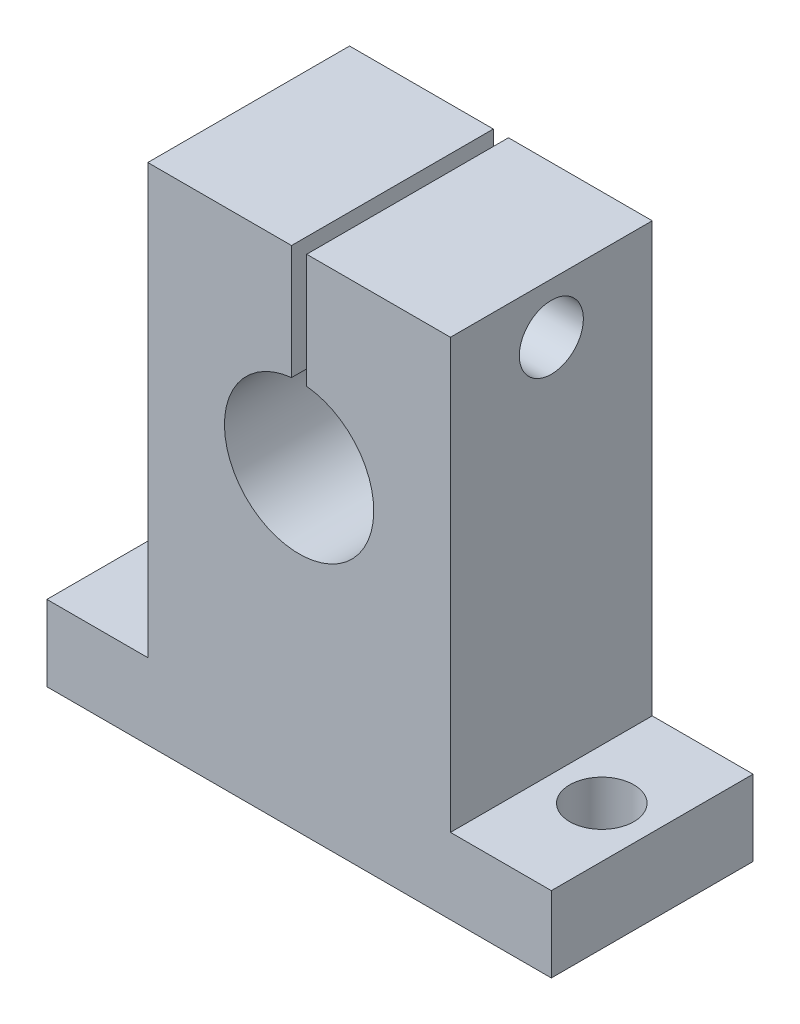
ISO-10303-21;
HEADER;
FILE_DESCRIPTION(('STEP AP214'),'2;1');
FILE_NAME('part.step','',(''),(''),'','','');
FILE_SCHEMA(('AUTOMOTIVE_DESIGN { 1 0 10303 214 1 1 1 1 }'));
ENDSEC;
DATA;
#1=APPLICATION_CONTEXT('core data for automotive mechanical design processes');
#2=APPLICATION_PROTOCOL_DEFINITION('international standard','automotive_design',2000,#1);
#3=PRODUCT_CONTEXT('',#1,'mechanical');
#4=PRODUCT('Part','Part','',(#3));
#5=PRODUCT_RELATED_PRODUCT_CATEGORY('part','',(#4));
#6=PRODUCT_DEFINITION_FORMATION('','',#4);
#7=PRODUCT_DEFINITION_CONTEXT('part definition',#1,'design');
#8=PRODUCT_DEFINITION('design','',#6,#7);
#9=PRODUCT_DEFINITION_SHAPE('','',#8);
#10=(LENGTH_UNIT() NAMED_UNIT(*) SI_UNIT(.MILLI.,.METRE.));
#11=(NAMED_UNIT(*) PLANE_ANGLE_UNIT() SI_UNIT($,.RADIAN.));
#12=(NAMED_UNIT(*) SI_UNIT($,.STERADIAN.) SOLID_ANGLE_UNIT());
#13=UNCERTAINTY_MEASURE_WITH_UNIT(LENGTH_MEASURE(1.E-05),#10,'distance_accuracy_value','');
#14=(GEOMETRIC_REPRESENTATION_CONTEXT(3) GLOBAL_UNCERTAINTY_ASSIGNED_CONTEXT((#13)) GLOBAL_UNIT_ASSIGNED_CONTEXT((#10,
#11,#12)) REPRESENTATION_CONTEXT('',''));
#15=CARTESIAN_POINT('',(0.,0.,0.));
#16=DIRECTION('',(0.,0.,1.));
#17=DIRECTION('',(1.,0.,0.));
#18=AXIS2_PLACEMENT_3D('',#15,#16,#17);
#19=CARTESIAN_POINT('',(0.,0.,20.));
#20=DIRECTION('',(0.,0.,-1.));
#21=DIRECTION('',(-1.,0.,0.));
#22=AXIS2_PLACEMENT_3D('',#19,#20,#21);
#23=CYLINDRICAL_SURFACE('',#22,7.4);
#24=CARTESIAN_POINT('',(0.,0.,0.));
#25=DIRECTION('',(0.,0.,-1.));
#26=DIRECTION('',(1.,0.,0.));
#27=AXIS2_PLACEMENT_3D('',#24,#25,#26);
#28=CIRCLE('',#27,7.4);
#29=CARTESIAN_POINT('',(0.749999999999998,7.36189513644415,0.));
#30=VERTEX_POINT('',#29);
#31=CARTESIAN_POINT('',(-0.749999999999991,7.36189513644415,0.));
#32=VERTEX_POINT('',#31);
#33=EDGE_CURVE('E154',#30,#32,#28,.T.);
#34=ORIENTED_EDGE('',*,*,#33,.T.);
#35=DIRECTION('',(0.,0.,-1.));
#36=VECTOR('',#35,1.);
#37=CARTESIAN_POINT('',(-0.749999999999991,7.36189513644415,20.));
#38=LINE('',#37,#36);
#39=CARTESIAN_POINT('',(-0.749999999999991,7.36189513644415,20.));
#40=VERTEX_POINT('',#39);
#41=EDGE_CURVE('E11',#40,#32,#38,.T.);
#42=ORIENTED_EDGE('',*,*,#41,.F.);
#43=CARTESIAN_POINT('',(0.,0.,20.));
#44=DIRECTION('',(0.,0.,-1.));
#45=DIRECTION('',(1.,0.,0.));
#46=AXIS2_PLACEMENT_3D('',#43,#44,#45);
#47=CIRCLE('',#46,7.4);
#48=CARTESIAN_POINT('',(0.749999999999998,7.36189513644415,20.));
#49=VERTEX_POINT('',#48);
#50=EDGE_CURVE('E177',#49,#40,#47,.T.);
#51=ORIENTED_EDGE('',*,*,#50,.F.);
#52=DIRECTION('',(0.,0.,-1.));
#53=VECTOR('',#52,1.);
#54=CARTESIAN_POINT('',(0.749999999999998,7.36189513644415,20.));
#55=LINE('',#54,#53);
#56=EDGE_CURVE('E150',#49,#30,#55,.T.);
#57=ORIENTED_EDGE('',*,*,#56,.T.);
#58=EDGE_LOOP('',(#34,#42,#51,#57));
#59=FACE_BOUND('',#58,.T.);
#60=ADVANCED_FACE('F33',(#59),#23,.F.);
#61=CARTESIAN_POINT('',(-0.749999999999998,18.7,20.));
#62=DIRECTION('',(-1.,0.,0.));
#63=DIRECTION('',(0.,-1.,0.));
#64=AXIS2_PLACEMENT_3D('',#61,#62,#63);
#65=PLANE('',#64);
#66=CARTESIAN_POINT('',(-0.749999999999994,13.7,10.));
#67=DIRECTION('',(-1.,0.,0.));
#68=DIRECTION('',(0.,-1.,0.));
#69=AXIS2_PLACEMENT_3D('',#66,#67,#68);
#70=CIRCLE('',#69,3.175);
#71=CARTESIAN_POINT('',(-0.749999999999992,10.525,10.));
#72=VERTEX_POINT('',#71);
#73=EDGE_CURVE('E299',#72,#72,#70,.T.);
#74=ORIENTED_EDGE('',*,*,#73,.T.);
#75=EDGE_LOOP('',(#74));
#76=FACE_BOUND('',#75,.T.);
#77=DIRECTION('',(0.,1.,0.));
#78=VECTOR('',#77,1.);
#79=CARTESIAN_POINT('',(-0.749999999999998,18.7,0.));
#80=LINE('',#79,#78);
#81=CARTESIAN_POINT('',(-0.749999999999998,18.7,0.));
#82=VERTEX_POINT('',#81);
#83=EDGE_CURVE('E157',#32,#82,#80,.T.);
#84=ORIENTED_EDGE('',*,*,#83,.T.);
#85=DIRECTION('',(0.,0.,-1.));
#86=VECTOR('',#85,1.);
#87=CARTESIAN_POINT('',(-0.749999999999998,18.7,20.));
#88=LINE('',#87,#86);
#89=CARTESIAN_POINT('',(-0.749999999999998,18.7,20.));
#90=VERTEX_POINT('',#89);
#91=EDGE_CURVE('E42',#90,#82,#88,.T.);
#92=ORIENTED_EDGE('',*,*,#91,.F.);
#93=DIRECTION('',(0.,1.,0.));
#94=VECTOR('',#93,1.);
#95=CARTESIAN_POINT('',(-0.749999999999998,18.7,20.));
#96=LINE('',#95,#94);
#97=EDGE_CURVE('E105',#40,#90,#96,.T.);
#98=ORIENTED_EDGE('',*,*,#97,.F.);
#99=ORIENTED_EDGE('',*,*,#41,.T.);
#100=EDGE_LOOP('',(#84,#92,#98,#99));
#101=FACE_BOUND('',#100,.T.);
#102=ADVANCED_FACE('F258',(#76,#101),#65,.F.);
#103=CARTESIAN_POINT('',(-15.,18.7,20.));
#104=DIRECTION('',(0.,-1.,0.));
#105=DIRECTION('',(1.,0.,0.));
#106=AXIS2_PLACEMENT_3D('',#103,#104,#105);
#107=PLANE('',#106);
#108=DIRECTION('',(-1.,0.,0.));
#109=VECTOR('',#108,1.);
#110=CARTESIAN_POINT('',(-15.,18.7,0.));
#111=LINE('',#110,#109);
#112=CARTESIAN_POINT('',(-15.,18.7,0.));
#113=VERTEX_POINT('',#112);
#114=EDGE_CURVE('E160',#82,#113,#111,.T.);
#115=ORIENTED_EDGE('',*,*,#114,.T.);
#116=DIRECTION('',(0.,0.,-1.));
#117=VECTOR('',#116,1.);
#118=CARTESIAN_POINT('',(-15.,18.7,20.));
#119=LINE('',#118,#117);
#120=CARTESIAN_POINT('',(-15.,18.7,20.));
#121=VERTEX_POINT('',#120);
#122=EDGE_CURVE('E196',#121,#113,#119,.T.);
#123=ORIENTED_EDGE('',*,*,#122,.F.);
#124=DIRECTION('',(-1.,0.,0.));
#125=VECTOR('',#124,1.);
#126=CARTESIAN_POINT('',(-15.,18.7,20.));
#127=LINE('',#126,#125);
#128=EDGE_CURVE('E205',#90,#121,#127,.T.);
#129=ORIENTED_EDGE('',*,*,#128,.F.);
#130=ORIENTED_EDGE('',*,*,#91,.T.);
#131=EDGE_LOOP('',(#115,#123,#129,#130));
#132=FACE_BOUND('',#131,.T.);
#133=ADVANCED_FACE('F203',(#132),#107,.F.);
#134=CARTESIAN_POINT('',(-15.,18.7,20.));
#135=DIRECTION('',(1.,0.,0.));
#136=DIRECTION('',(0.,1.,0.));
#137=AXIS2_PLACEMENT_3D('',#134,#135,#136);
#138=PLANE('',#137);
#139=CARTESIAN_POINT('',(-15.,13.7,10.));
#140=DIRECTION('',(1.,0.,0.));
#141=DIRECTION('',(0.,1.,0.));
#142=AXIS2_PLACEMENT_3D('',#139,#140,#141);
#143=CIRCLE('',#142,3.175);
#144=CARTESIAN_POINT('',(-15.,16.875,10.));
#145=VERTEX_POINT('',#144);
#146=EDGE_CURVE('E296',#145,#145,#143,.T.);
#147=ORIENTED_EDGE('',*,*,#146,.T.);
#148=EDGE_LOOP('',(#147));
#149=FACE_BOUND('',#148,.T.);
#150=DIRECTION('',(0.,-1.,0.));
#151=VECTOR('',#150,1.);
#152=CARTESIAN_POINT('',(-15.,18.7,0.));
#153=LINE('',#152,#151);
#154=CARTESIAN_POINT('',(-15.,-23.8,0.));
#155=VERTEX_POINT('',#154);
#156=EDGE_CURVE('E162',#113,#155,#153,.T.);
#157=ORIENTED_EDGE('',*,*,#156,.T.);
#158=DIRECTION('',(0.,0.,-1.));
#159=VECTOR('',#158,1.);
#160=CARTESIAN_POINT('',(-15.,-23.8,20.));
#161=LINE('',#160,#159);
#162=CARTESIAN_POINT('',(-15.,-23.8,20.));
#163=VERTEX_POINT('',#162);
#164=EDGE_CURVE('E193',#163,#155,#161,.T.);
#165=ORIENTED_EDGE('',*,*,#164,.F.);
#166=DIRECTION('',(0.,-1.,0.));
#167=VECTOR('',#166,1.);
#168=CARTESIAN_POINT('',(-15.,18.7,20.));
#169=LINE('',#168,#167);
#170=EDGE_CURVE('E223',#121,#163,#169,.T.);
#171=ORIENTED_EDGE('',*,*,#170,.F.);
#172=ORIENTED_EDGE('',*,*,#122,.T.);
#173=EDGE_LOOP('',(#157,#165,#171,#172));
#174=FACE_BOUND('',#173,.T.);
#175=ADVANCED_FACE('F214',(#149,#174),#138,.F.);
#176=CARTESIAN_POINT('',(-25.,-23.8,20.));
#177=DIRECTION('',(0.,-1.,0.));
#178=DIRECTION('',(0.,0.,-1.));
#179=AXIS2_PLACEMENT_3D('',#176,#177,#178);
#180=PLANE('',#179);
#181=CARTESIAN_POINT('',(-20.,-23.8,10.));
#182=DIRECTION('',(0.,1.,0.));
#183=DIRECTION('',(0.,0.,1.));
#184=AXIS2_PLACEMENT_3D('',#181,#182,#183);
#185=CIRCLE('',#184,3.175);
#186=CARTESIAN_POINT('',(-20.,-23.8,13.175));
#187=VERTEX_POINT('',#186);
#188=EDGE_CURVE('E306',#187,#187,#185,.T.);
#189=ORIENTED_EDGE('',*,*,#188,.F.);
#190=EDGE_LOOP('',(#189));
#191=FACE_BOUND('',#190,.T.);
#192=DIRECTION('',(-1.,0.,0.));
#193=VECTOR('',#192,1.);
#194=CARTESIAN_POINT('',(-25.,-23.8,0.));
#195=LINE('',#194,#193);
#196=CARTESIAN_POINT('',(-25.,-23.8,0.));
#197=VERTEX_POINT('',#196);
#198=EDGE_CURVE('E164',#155,#197,#195,.T.);
#199=ORIENTED_EDGE('',*,*,#198,.T.);
#200=DIRECTION('',(0.,0.,-1.));
#201=VECTOR('',#200,1.);
#202=CARTESIAN_POINT('',(-25.,-23.8,20.));
#203=LINE('',#202,#201);
#204=CARTESIAN_POINT('',(-25.,-23.8,20.));
#205=VERTEX_POINT('',#204);
#206=EDGE_CURVE('E190',#205,#197,#203,.T.);
#207=ORIENTED_EDGE('',*,*,#206,.F.);
#208=DIRECTION('',(-1.,0.,0.));
#209=VECTOR('',#208,1.);
#210=CARTESIAN_POINT('',(-25.,-23.8,20.));
#211=LINE('',#210,#209);
#212=EDGE_CURVE('E220',#163,#205,#211,.T.);
#213=ORIENTED_EDGE('',*,*,#212,.F.);
#214=ORIENTED_EDGE('',*,*,#164,.T.);
#215=EDGE_LOOP('',(#199,#207,#213,#214));
#216=FACE_BOUND('',#215,.T.);
#217=ADVANCED_FACE('F218',(#191,#216),#180,.F.);
#218=CARTESIAN_POINT('',(-25.,-23.8,20.));
#219=DIRECTION('',(1.,0.,0.));
#220=DIRECTION('',(0.,0.,-1.));
#221=AXIS2_PLACEMENT_3D('',#218,#219,#220);
#222=PLANE('',#221);
#223=DIRECTION('',(0.,-1.,0.));
#224=VECTOR('',#223,1.);
#225=CARTESIAN_POINT('',(-25.,-23.8,0.));
#226=LINE('',#225,#224);
#227=CARTESIAN_POINT('',(-25.,-31.3,0.));
#228=VERTEX_POINT('',#227);
#229=EDGE_CURVE('E166',#197,#228,#226,.T.);
#230=ORIENTED_EDGE('',*,*,#229,.T.);
#231=DIRECTION('',(0.,0.,-1.));
#232=VECTOR('',#231,1.);
#233=CARTESIAN_POINT('',(-25.,-31.3,20.));
#234=LINE('',#233,#232);
#235=CARTESIAN_POINT('',(-25.,-31.3,20.));
#236=VERTEX_POINT('',#235);
#237=EDGE_CURVE('E187',#236,#228,#234,.T.);
#238=ORIENTED_EDGE('',*,*,#237,.F.);
#239=DIRECTION('',(0.,-1.,0.));
#240=VECTOR('',#239,1.);
#241=CARTESIAN_POINT('',(-25.,-23.8,20.));
#242=LINE('',#241,#240);
#243=EDGE_CURVE('E222',#205,#236,#242,.T.);
#244=ORIENTED_EDGE('',*,*,#243,.F.);
#245=ORIENTED_EDGE('',*,*,#206,.T.);
#246=EDGE_LOOP('',(#230,#238,#244,#245));
#247=FACE_BOUND('',#246,.T.);
#248=ADVANCED_FACE('F274',(#247),#222,.F.);
#249=CARTESIAN_POINT('',(-25.,-31.3,20.));
#250=DIRECTION('',(0.,1.,0.));
#251=DIRECTION('',(-1.,0.,0.));
#252=AXIS2_PLACEMENT_3D('',#249,#250,#251);
#253=PLANE('',#252);
#254=CARTESIAN_POINT('',(-20.,-31.3,10.));
#255=DIRECTION('',(0.,1.,0.));
#256=DIRECTION('',(0.,0.,1.));
#257=AXIS2_PLACEMENT_3D('',#254,#255,#256);
#258=CIRCLE('',#257,3.175);
#259=CARTESIAN_POINT('',(-20.,-31.3,13.175));
#260=VERTEX_POINT('',#259);
#261=EDGE_CURVE('E158',#260,#260,#258,.T.);
#262=ORIENTED_EDGE('',*,*,#261,.T.);
#263=EDGE_LOOP('',(#262));
#264=FACE_BOUND('',#263,.T.);
#265=CARTESIAN_POINT('',(20.,-31.3,10.));
#266=DIRECTION('',(0.,1.,0.));
#267=DIRECTION('',(0.,0.,1.));
#268=AXIS2_PLACEMENT_3D('',#265,#266,#267);
#269=CIRCLE('',#268,3.175);
#270=CARTESIAN_POINT('',(20.,-31.3,13.175));
#271=VERTEX_POINT('',#270);
#272=EDGE_CURVE('E309',#271,#271,#269,.T.);
#273=ORIENTED_EDGE('',*,*,#272,.T.);
#274=EDGE_LOOP('',(#273));
#275=FACE_BOUND('',#274,.T.);
#276=DIRECTION('',(1.,0.,0.));
#277=VECTOR('',#276,1.);
#278=CARTESIAN_POINT('',(-25.,-31.3,0.));
#279=LINE('',#278,#277);
#280=CARTESIAN_POINT('',(25.,-31.3,0.));
#281=VERTEX_POINT('',#280);
#282=EDGE_CURVE('E168',#228,#281,#279,.T.);
#283=ORIENTED_EDGE('',*,*,#282,.T.);
#284=DIRECTION('',(0.,0.,-1.));
#285=VECTOR('',#284,1.);
#286=CARTESIAN_POINT('',(25.,-31.3,20.));
#287=LINE('',#286,#285);
#288=CARTESIAN_POINT('',(25.,-31.3,20.));
#289=VERTEX_POINT('',#288);
#290=EDGE_CURVE('E184',#289,#281,#287,.T.);
#291=ORIENTED_EDGE('',*,*,#290,.F.);
#292=DIRECTION('',(1.,0.,0.));
#293=VECTOR('',#292,1.);
#294=CARTESIAN_POINT('',(-25.,-31.3,20.));
#295=LINE('',#294,#293);
#296=EDGE_CURVE('E225',#236,#289,#295,.T.);
#297=ORIENTED_EDGE('',*,*,#296,.F.);
#298=ORIENTED_EDGE('',*,*,#237,.T.);
#299=EDGE_LOOP('',(#283,#291,#297,#298));
#300=FACE_BOUND('',#299,.T.);
#301=ADVANCED_FACE('F278',(#264,#275,#300),#253,.F.);
#302=CARTESIAN_POINT('',(25.,-23.8,20.));
#303=DIRECTION('',(-1.,0.,0.));
#304=DIRECTION('',(0.,0.,1.));
#305=AXIS2_PLACEMENT_3D('',#302,#303,#304);
#306=PLANE('',#305);
#307=DIRECTION('',(0.,1.,0.));
#308=VECTOR('',#307,1.);
#309=CARTESIAN_POINT('',(25.,-23.8,0.));
#310=LINE('',#309,#308);
#311=CARTESIAN_POINT('',(25.,-23.8,0.));
#312=VERTEX_POINT('',#311);
#313=EDGE_CURVE('E170',#281,#312,#310,.T.);
#314=ORIENTED_EDGE('',*,*,#313,.T.);
#315=DIRECTION('',(0.,0.,-1.));
#316=VECTOR('',#315,1.);
#317=CARTESIAN_POINT('',(25.,-23.8,20.));
#318=LINE('',#317,#316);
#319=CARTESIAN_POINT('',(25.,-23.8,20.));
#320=VERTEX_POINT('',#319);
#321=EDGE_CURVE('E181',#320,#312,#318,.T.);
#322=ORIENTED_EDGE('',*,*,#321,.F.);
#323=DIRECTION('',(0.,1.,0.));
#324=VECTOR('',#323,1.);
#325=CARTESIAN_POINT('',(25.,-23.8,20.));
#326=LINE('',#325,#324);
#327=EDGE_CURVE('E231',#289,#320,#326,.T.);
#328=ORIENTED_EDGE('',*,*,#327,.F.);
#329=ORIENTED_EDGE('',*,*,#290,.T.);
#330=EDGE_LOOP('',(#314,#322,#328,#329));
#331=FACE_BOUND('',#330,.T.);
#332=ADVANCED_FACE('F237',(#331),#306,.F.);
#333=CARTESIAN_POINT('',(15.,-23.8,20.));
#334=DIRECTION('',(0.,-1.,0.));
#335=DIRECTION('',(0.,0.,-1.));
#336=AXIS2_PLACEMENT_3D('',#333,#334,#335);
#337=PLANE('',#336);
#338=CARTESIAN_POINT('',(20.,-23.8,10.));
#339=DIRECTION('',(0.,1.,0.));
#340=DIRECTION('',(0.,0.,1.));
#341=AXIS2_PLACEMENT_3D('',#338,#339,#340);
#342=CIRCLE('',#341,3.175);
#343=CARTESIAN_POINT('',(20.,-23.8,13.175));
#344=VERTEX_POINT('',#343);
#345=EDGE_CURVE('E303',#344,#344,#342,.T.);
#346=ORIENTED_EDGE('',*,*,#345,.F.);
#347=EDGE_LOOP('',(#346));
#348=FACE_BOUND('',#347,.T.);
#349=DIRECTION('',(-1.,0.,0.));
#350=VECTOR('',#349,1.);
#351=CARTESIAN_POINT('',(15.,-23.8,0.));
#352=LINE('',#351,#350);
#353=CARTESIAN_POINT('',(15.,-23.8,0.));
#354=VERTEX_POINT('',#353);
#355=EDGE_CURVE('E172',#312,#354,#352,.T.);
#356=ORIENTED_EDGE('',*,*,#355,.T.);
#357=DIRECTION('',(0.,0.,-1.));
#358=VECTOR('',#357,1.);
#359=CARTESIAN_POINT('',(15.,-23.8,20.));
#360=LINE('',#359,#358);
#361=CARTESIAN_POINT('',(15.,-23.8,20.));
#362=VERTEX_POINT('',#361);
#363=EDGE_CURVE('E145',#362,#354,#360,.T.);
#364=ORIENTED_EDGE('',*,*,#363,.F.);
#365=DIRECTION('',(-1.,0.,0.));
#366=VECTOR('',#365,1.);
#367=CARTESIAN_POINT('',(15.,-23.8,20.));
#368=LINE('',#367,#366);
#369=EDGE_CURVE('E136',#320,#362,#368,.T.);
#370=ORIENTED_EDGE('',*,*,#369,.F.);
#371=ORIENTED_EDGE('',*,*,#321,.T.);
#372=EDGE_LOOP('',(#356,#364,#370,#371));
#373=FACE_BOUND('',#372,.T.);
#374=ADVANCED_FACE('F241',(#348,#373),#337,.F.);
#375=CARTESIAN_POINT('',(15.,18.7,20.));
#376=DIRECTION('',(-1.,0.,0.));
#377=DIRECTION('',(0.,-1.,0.));
#378=AXIS2_PLACEMENT_3D('',#375,#376,#377);
#379=PLANE('',#378);
#380=CARTESIAN_POINT('',(15.,13.7,10.));
#381=DIRECTION('',(-1.,0.,0.));
#382=DIRECTION('',(0.,-1.,0.));
#383=AXIS2_PLACEMENT_3D('',#380,#381,#382);
#384=CIRCLE('',#383,3.175);
#385=CARTESIAN_POINT('',(15.,10.525,10.));
#386=VERTEX_POINT('',#385);
#387=EDGE_CURVE('E294',#386,#386,#384,.T.);
#388=ORIENTED_EDGE('',*,*,#387,.T.);
#389=EDGE_LOOP('',(#388));
#390=FACE_BOUND('',#389,.T.);
#391=DIRECTION('',(0.,1.,0.));
#392=VECTOR('',#391,1.);
#393=CARTESIAN_POINT('',(15.,18.7,0.));
#394=LINE('',#393,#392);
#395=CARTESIAN_POINT('',(15.,18.7,0.));
#396=VERTEX_POINT('',#395);
#397=EDGE_CURVE('E144',#354,#396,#394,.T.);
#398=ORIENTED_EDGE('',*,*,#397,.T.);
#399=DIRECTION('',(0.,0.,-1.));
#400=VECTOR('',#399,1.);
#401=CARTESIAN_POINT('',(15.,18.7,20.));
#402=LINE('',#401,#400);
#403=CARTESIAN_POINT('',(15.,18.7,20.));
#404=VERTEX_POINT('',#403);
#405=EDGE_CURVE('E141',#404,#396,#402,.T.);
#406=ORIENTED_EDGE('',*,*,#405,.F.);
#407=DIRECTION('',(0.,1.,0.));
#408=VECTOR('',#407,1.);
#409=CARTESIAN_POINT('',(15.,18.7,20.));
#410=LINE('',#409,#408);
#411=EDGE_CURVE('E130',#362,#404,#410,.T.);
#412=ORIENTED_EDGE('',*,*,#411,.F.);
#413=ORIENTED_EDGE('',*,*,#363,.T.);
#414=EDGE_LOOP('',(#398,#406,#412,#413));
#415=FACE_BOUND('',#414,.T.);
#416=ADVANCED_FACE('F142',(#390,#415),#379,.F.);
#417=CARTESIAN_POINT('',(0.750000000000002,18.7,20.));
#418=DIRECTION('',(0.,-1.,0.));
#419=DIRECTION('',(0.,0.,-1.));
#420=AXIS2_PLACEMENT_3D('',#417,#418,#419);
#421=PLANE('',#420);
#422=DIRECTION('',(-1.,0.,0.));
#423=VECTOR('',#422,1.);
#424=CARTESIAN_POINT('',(0.750000000000002,18.7,0.));
#425=LINE('',#424,#423);
#426=CARTESIAN_POINT('',(0.750000000000002,18.7,0.));
#427=VERTEX_POINT('',#426);
#428=EDGE_CURVE('E91',#396,#427,#425,.T.);
#429=ORIENTED_EDGE('',*,*,#428,.T.);
#430=DIRECTION('',(0.,0.,-1.));
#431=VECTOR('',#430,1.);
#432=CARTESIAN_POINT('',(0.750000000000002,18.7,20.));
#433=LINE('',#432,#431);
#434=CARTESIAN_POINT('',(0.750000000000002,18.7,20.));
#435=VERTEX_POINT('',#434);
#436=EDGE_CURVE('E146',#435,#427,#433,.T.);
#437=ORIENTED_EDGE('',*,*,#436,.F.);
#438=DIRECTION('',(-1.,0.,0.));
#439=VECTOR('',#438,1.);
#440=CARTESIAN_POINT('',(0.750000000000002,18.7,20.));
#441=LINE('',#440,#439);
#442=EDGE_CURVE('E134',#404,#435,#441,.T.);
#443=ORIENTED_EDGE('',*,*,#442,.F.);
#444=ORIENTED_EDGE('',*,*,#405,.T.);
#445=EDGE_LOOP('',(#429,#437,#443,#444));
#446=FACE_BOUND('',#445,.T.);
#447=ADVANCED_FACE('F148',(#446),#421,.F.);
#448=CARTESIAN_POINT('',(0.750000000000002,18.7,20.));
#449=DIRECTION('',(1.,0.,0.));
#450=DIRECTION('',(0.,1.,0.));
#451=AXIS2_PLACEMENT_3D('',#448,#449,#450);
#452=PLANE('',#451);
#453=CARTESIAN_POINT('',(0.749999999999997,13.7,10.));
#454=DIRECTION('',(1.,0.,0.));
#455=DIRECTION('',(0.,1.,0.));
#456=AXIS2_PLACEMENT_3D('',#453,#454,#455);
#457=CIRCLE('',#456,3.175);
#458=CARTESIAN_POINT('',(0.749999999999998,16.875,10.));
#459=VERTEX_POINT('',#458);
#460=EDGE_CURVE('E36',#459,#459,#457,.T.);
#461=ORIENTED_EDGE('',*,*,#460,.T.);
#462=EDGE_LOOP('',(#461));
#463=FACE_BOUND('',#462,.T.);
#464=DIRECTION('',(0.,-1.,0.));
#465=VECTOR('',#464,1.);
#466=CARTESIAN_POINT('',(0.750000000000002,18.7,0.));
#467=LINE('',#466,#465);
#468=EDGE_CURVE('E97',#427,#30,#467,.T.);
#469=ORIENTED_EDGE('',*,*,#468,.T.);
#470=ORIENTED_EDGE('',*,*,#56,.F.);
#471=DIRECTION('',(0.,-1.,0.));
#472=VECTOR('',#471,1.);
#473=CARTESIAN_POINT('',(0.750000000000002,18.7,20.));
#474=LINE('',#473,#472);
#475=EDGE_CURVE('E50',#435,#49,#474,.T.);
#476=ORIENTED_EDGE('',*,*,#475,.F.);
#477=ORIENTED_EDGE('',*,*,#436,.T.);
#478=EDGE_LOOP('',(#469,#470,#476,#477));
#479=FACE_BOUND('',#478,.T.);
#480=ADVANCED_FACE('F245',(#463,#479),#452,.F.);
#481=CARTESIAN_POINT('',(0.,0.,20.));
#482=DIRECTION('',(0.,0.,1.));
#483=DIRECTION('',(1.,0.,0.));
#484=AXIS2_PLACEMENT_3D('',#481,#482,#483);
#485=PLANE('',#484);
#486=ORIENTED_EDGE('',*,*,#50,.T.);
#487=ORIENTED_EDGE('',*,*,#97,.T.);
#488=ORIENTED_EDGE('',*,*,#128,.T.);
#489=ORIENTED_EDGE('',*,*,#170,.T.);
#490=ORIENTED_EDGE('',*,*,#212,.T.);
#491=ORIENTED_EDGE('',*,*,#243,.T.);
#492=ORIENTED_EDGE('',*,*,#296,.T.);
#493=ORIENTED_EDGE('',*,*,#327,.T.);
#494=ORIENTED_EDGE('',*,*,#369,.T.);
#495=ORIENTED_EDGE('',*,*,#411,.T.);
#496=ORIENTED_EDGE('',*,*,#442,.T.);
#497=ORIENTED_EDGE('',*,*,#475,.T.);
#498=EDGE_LOOP('',(#486,#487,#488,#489,#490,#491,#492,#493,#494,#495,#496,#497));
#499=FACE_BOUND('',#498,.T.);
#500=ADVANCED_FACE('F132',(#499),#485,.T.);
#501=CARTESIAN_POINT('',(0.,0.,0.));
#502=DIRECTION('',(0.,0.,1.));
#503=DIRECTION('',(1.,0.,0.));
#504=AXIS2_PLACEMENT_3D('',#501,#502,#503);
#505=PLANE('',#504);
#506=ORIENTED_EDGE('',*,*,#33,.F.);
#507=ORIENTED_EDGE('',*,*,#468,.F.);
#508=ORIENTED_EDGE('',*,*,#428,.F.);
#509=ORIENTED_EDGE('',*,*,#397,.F.);
#510=ORIENTED_EDGE('',*,*,#355,.F.);
#511=ORIENTED_EDGE('',*,*,#313,.F.);
#512=ORIENTED_EDGE('',*,*,#282,.F.);
#513=ORIENTED_EDGE('',*,*,#229,.F.);
#514=ORIENTED_EDGE('',*,*,#198,.F.);
#515=ORIENTED_EDGE('',*,*,#156,.F.);
#516=ORIENTED_EDGE('',*,*,#114,.F.);
#517=ORIENTED_EDGE('',*,*,#83,.F.);
#518=EDGE_LOOP('',(#506,#507,#508,#509,#510,#511,#512,#513,#514,#515,#516,#517));
#519=FACE_BOUND('',#518,.T.);
#520=ADVANCED_FACE('F209',(#519),#505,.F.);
#521=CARTESIAN_POINT('',(20.,-31.3,10.));
#522=DIRECTION('',(0.,1.,0.));
#523=DIRECTION('',(0.,0.,1.));
#524=AXIS2_PLACEMENT_3D('',#521,#522,#523);
#525=CYLINDRICAL_SURFACE('',#524,3.175);
#526=ORIENTED_EDGE('',*,*,#272,.F.);
#527=EDGE_LOOP('',(#526));
#528=FACE_BOUND('',#527,.T.);
#529=ORIENTED_EDGE('',*,*,#345,.T.);
#530=EDGE_LOOP('',(#529));
#531=FACE_BOUND('',#530,.T.);
#532=ADVANCED_FACE('F317',(#528,#531),#525,.F.);
#533=CARTESIAN_POINT('',(-20.,-31.3,10.));
#534=DIRECTION('',(0.,1.,0.));
#535=DIRECTION('',(0.,0.,1.));
#536=AXIS2_PLACEMENT_3D('',#533,#534,#535);
#537=CYLINDRICAL_SURFACE('',#536,3.175);
#538=ORIENTED_EDGE('',*,*,#261,.F.);
#539=EDGE_LOOP('',(#538));
#540=FACE_BOUND('',#539,.T.);
#541=ORIENTED_EDGE('',*,*,#188,.T.);
#542=EDGE_LOOP('',(#541));
#543=FACE_BOUND('',#542,.T.);
#544=ADVANCED_FACE('F319',(#540,#543),#537,.F.);
#545=CARTESIAN_POINT('',(-25.,13.7,10.));
#546=DIRECTION('',(1.,0.,0.));
#547=DIRECTION('',(0.,1.,0.));
#548=AXIS2_PLACEMENT_3D('',#545,#546,#547);
#549=CYLINDRICAL_SURFACE('',#548,3.175);
#550=ORIENTED_EDGE('',*,*,#460,.F.);
#551=EDGE_LOOP('',(#550));
#552=FACE_BOUND('',#551,.T.);
#553=ORIENTED_EDGE('',*,*,#387,.F.);
#554=EDGE_LOOP('',(#553));
#555=FACE_BOUND('',#554,.T.);
#556=ADVANCED_FACE('F326',(#552,#555),#549,.F.);
#557=ORIENTED_EDGE('',*,*,#146,.F.);
#558=EDGE_LOOP('',(#557));
#559=FACE_BOUND('',#558,.T.);
#560=ORIENTED_EDGE('',*,*,#73,.F.);
#561=EDGE_LOOP('',(#560));
#562=FACE_BOUND('',#561,.T.);
#563=ADVANCED_FACE('F331',(#559,#562),#549,.F.);
#564=CLOSED_SHELL('',(#60,#102,#133,#175,#217,#248,#301,#332,#374,#416,#447,#480,#500,#520,#532,
#544,#556,#563));
#565=MANIFOLD_SOLID_BREP('B2',#564);
#566=ADVANCED_BREP_SHAPE_REPRESENTATION('',(#18,#565),#14);
#567=SHAPE_DEFINITION_REPRESENTATION(#9,#566);
ENDSEC;
END-ISO-10303-21;
